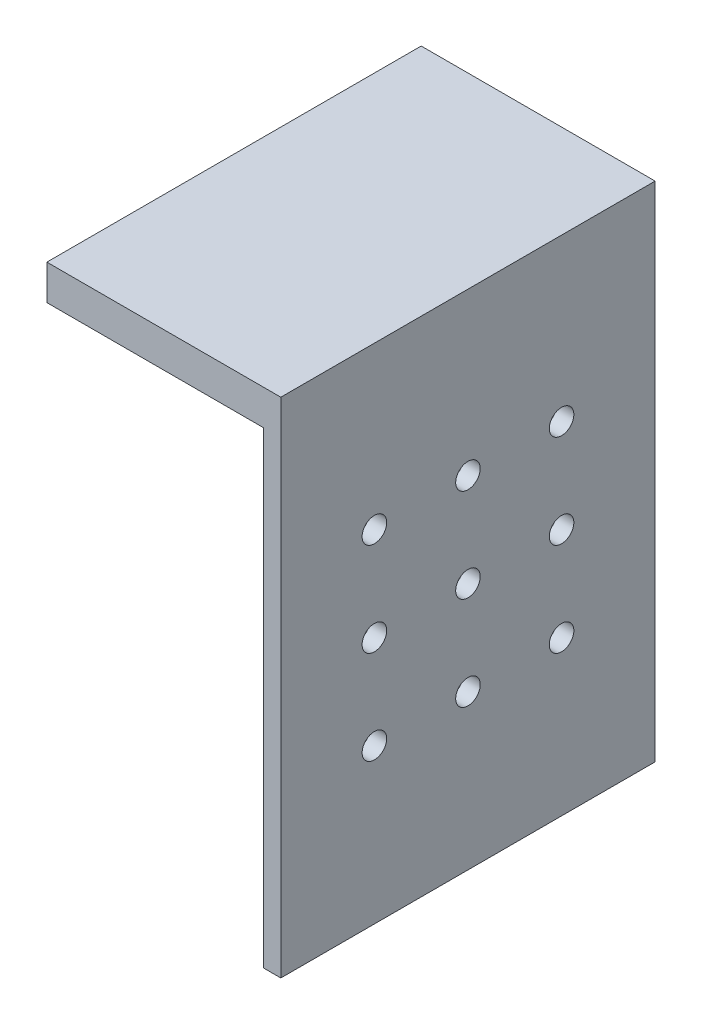
ISO-10303-21;
HEADER;
FILE_DESCRIPTION(('STEP AP214'),'2;1');
FILE_NAME('part.step','',(''),(''),'','','');
FILE_SCHEMA(('AUTOMOTIVE_DESIGN { 1 0 10303 214 1 1 1 1 }'));
ENDSEC;
DATA;
#1=APPLICATION_CONTEXT('core data for automotive mechanical design processes');
#2=APPLICATION_PROTOCOL_DEFINITION('international standard','automotive_design',2000,#1);
#3=PRODUCT_CONTEXT('',#1,'mechanical');
#4=PRODUCT('Part','Part','',(#3));
#5=PRODUCT_RELATED_PRODUCT_CATEGORY('part','',(#4));
#6=PRODUCT_DEFINITION_FORMATION('','',#4);
#7=PRODUCT_DEFINITION_CONTEXT('part definition',#1,'design');
#8=PRODUCT_DEFINITION('design','',#6,#7);
#9=PRODUCT_DEFINITION_SHAPE('','',#8);
#10=(LENGTH_UNIT() NAMED_UNIT(*) SI_UNIT(.MILLI.,.METRE.));
#11=(NAMED_UNIT(*) PLANE_ANGLE_UNIT() SI_UNIT($,.RADIAN.));
#12=(NAMED_UNIT(*) SI_UNIT($,.STERADIAN.) SOLID_ANGLE_UNIT());
#13=UNCERTAINTY_MEASURE_WITH_UNIT(LENGTH_MEASURE(1.E-05),#10,'distance_accuracy_value','');
#14=(GEOMETRIC_REPRESENTATION_CONTEXT(3) GLOBAL_UNCERTAINTY_ASSIGNED_CONTEXT((#13)) GLOBAL_UNIT_ASSIGNED_CONTEXT((#10,
#11,#12)) REPRESENTATION_CONTEXT('',''));
#15=CARTESIAN_POINT('',(0.,0.,0.));
#16=DIRECTION('',(0.,0.,1.));
#17=DIRECTION('',(1.,0.,0.));
#18=AXIS2_PLACEMENT_3D('',#15,#16,#17);
#19=CARTESIAN_POINT('',(0.,0.,32.));
#20=DIRECTION('',(1.,0.,0.));
#21=DIRECTION('',(0.,0.,-1.));
#22=AXIS2_PLACEMENT_3D('',#19,#20,#21);
#23=PLANE('',#22);
#24=DIRECTION('',(0.,-1.,0.));
#25=VECTOR('',#24,1.);
#26=CARTESIAN_POINT('',(0.,0.,32.));
#27=LINE('',#26,#25);
#28=CARTESIAN_POINT('',(0.,48.,32.));
#29=VERTEX_POINT('',#28);
#30=CARTESIAN_POINT('',(0.,45.,32.));
#31=VERTEX_POINT('',#30);
#32=EDGE_CURVE('E49',#29,#31,#27,.T.);
#33=ORIENTED_EDGE('',*,*,#32,.F.);
#34=DIRECTION('',(0.,0.,1.));
#35=VECTOR('',#34,1.);
#36=CARTESIAN_POINT('',(0.,48.,0.));
#37=LINE('',#36,#35);
#38=CARTESIAN_POINT('',(0.,48.,0.));
#39=VERTEX_POINT('',#38);
#40=EDGE_CURVE('E96',#39,#29,#37,.T.);
#41=ORIENTED_EDGE('',*,*,#40,.F.);
#42=DIRECTION('',(0.,-1.,0.));
#43=VECTOR('',#42,1.);
#44=CARTESIAN_POINT('',(0.,0.,0.));
#45=LINE('',#44,#43);
#46=CARTESIAN_POINT('',(0.,45.,0.));
#47=VERTEX_POINT('',#46);
#48=EDGE_CURVE('E107',#39,#47,#45,.T.);
#49=ORIENTED_EDGE('',*,*,#48,.T.);
#50=DIRECTION('',(0.,0.,1.));
#51=VECTOR('',#50,1.);
#52=CARTESIAN_POINT('',(0.,45.,0.));
#53=LINE('',#52,#51);
#54=EDGE_CURVE('E115',#47,#31,#53,.T.);
#55=ORIENTED_EDGE('',*,*,#54,.T.);
#56=EDGE_LOOP('',(#33,#41,#49,#55));
#57=FACE_BOUND('',#56,.T.);
#58=ADVANCED_FACE('F41',(#57),#23,.F.);
#59=CARTESIAN_POINT('',(0.,0.,32.));
#60=DIRECTION('',(0.,0.,-1.));
#61=DIRECTION('',(-1.,0.,0.));
#62=AXIS2_PLACEMENT_3D('',#59,#60,#61);
#63=PLANE('',#62);
#64=DIRECTION('',(0.,-1.,0.));
#65=VECTOR('',#64,1.);
#66=CARTESIAN_POINT('',(20.,50.,32.));
#67=LINE('',#66,#65);
#68=CARTESIAN_POINT('',(20.,48.,32.));
#69=VERTEX_POINT('',#68);
#70=CARTESIAN_POINT('',(20.,5.,32.));
#71=VERTEX_POINT('',#70);
#72=EDGE_CURVE('E130',#69,#71,#67,.T.);
#73=ORIENTED_EDGE('',*,*,#72,.F.);
#74=DIRECTION('',(1.,0.,0.));
#75=VECTOR('',#74,1.);
#76=CARTESIAN_POINT('',(0.,48.,32.));
#77=LINE('',#76,#75);
#78=EDGE_CURVE('E56',#29,#69,#77,.T.);
#79=ORIENTED_EDGE('',*,*,#78,.F.);
#80=ORIENTED_EDGE('',*,*,#32,.T.);
#81=DIRECTION('',(-1.,0.,0.));
#82=VECTOR('',#81,1.);
#83=CARTESIAN_POINT('',(13.,45.,32.));
#84=LINE('',#83,#82);
#85=CARTESIAN_POINT('',(18.5380609826533,45.,32.));
#86=VERTEX_POINT('',#85);
#87=EDGE_CURVE('E121',#86,#31,#84,.T.);
#88=ORIENTED_EDGE('',*,*,#87,.F.);
#89=DIRECTION('',(0.,1.,0.));
#90=VECTOR('',#89,1.);
#91=CARTESIAN_POINT('',(18.5380609826533,45.,32.));
#92=LINE('',#91,#90);
#93=CARTESIAN_POINT('',(18.5380609826533,5.,32.));
#94=VERTEX_POINT('',#93);
#95=EDGE_CURVE('E228',#94,#86,#92,.T.);
#96=ORIENTED_EDGE('',*,*,#95,.F.);
#97=DIRECTION('',(-1.,0.,0.));
#98=VECTOR('',#97,1.);
#99=CARTESIAN_POINT('',(16.,5.,32.));
#100=LINE('',#99,#98);
#101=EDGE_CURVE('E178',#71,#94,#100,.T.);
#102=ORIENTED_EDGE('',*,*,#101,.F.);
#103=EDGE_LOOP('',(#73,#79,#80,#88,#96,#102));
#104=FACE_BOUND('',#103,.T.);
#105=ADVANCED_FACE('F244',(#104),#63,.F.);
#106=CARTESIAN_POINT('',(0.,0.,0.));
#107=DIRECTION('',(0.,0.,-1.));
#108=DIRECTION('',(-1.,0.,0.));
#109=AXIS2_PLACEMENT_3D('',#106,#107,#108);
#110=PLANE('',#109);
#111=DIRECTION('',(1.,0.,0.));
#112=VECTOR('',#111,1.);
#113=CARTESIAN_POINT('',(0.,48.,0.));
#114=LINE('',#113,#112);
#115=CARTESIAN_POINT('',(20.,48.,0.));
#116=VERTEX_POINT('',#115);
#117=EDGE_CURVE('E93',#39,#116,#114,.T.);
#118=ORIENTED_EDGE('',*,*,#117,.T.);
#119=DIRECTION('',(0.,1.,0.));
#120=VECTOR('',#119,1.);
#121=CARTESIAN_POINT('',(20.,50.,0.));
#122=LINE('',#121,#120);
#123=CARTESIAN_POINT('',(20.,5.,0.));
#124=VERTEX_POINT('',#123);
#125=EDGE_CURVE('E125',#124,#116,#122,.T.);
#126=ORIENTED_EDGE('',*,*,#125,.F.);
#127=DIRECTION('',(-1.,0.,0.));
#128=VECTOR('',#127,1.);
#129=CARTESIAN_POINT('',(16.,5.,0.));
#130=LINE('',#129,#128);
#131=CARTESIAN_POINT('',(18.5380609826533,5.,0.));
#132=VERTEX_POINT('',#131);
#133=EDGE_CURVE('E177',#124,#132,#130,.T.);
#134=ORIENTED_EDGE('',*,*,#133,.T.);
#135=DIRECTION('',(0.,1.,0.));
#136=VECTOR('',#135,1.);
#137=CARTESIAN_POINT('',(18.5380609826533,45.,0.));
#138=LINE('',#137,#136);
#139=CARTESIAN_POINT('',(18.5380609826533,45.,0.));
#140=VERTEX_POINT('',#139);
#141=EDGE_CURVE('E64',#132,#140,#138,.T.);
#142=ORIENTED_EDGE('',*,*,#141,.T.);
#143=DIRECTION('',(-1.,0.,0.));
#144=VECTOR('',#143,1.);
#145=CARTESIAN_POINT('',(13.,45.,0.));
#146=LINE('',#145,#144);
#147=EDGE_CURVE('E113',#140,#47,#146,.T.);
#148=ORIENTED_EDGE('',*,*,#147,.T.);
#149=ORIENTED_EDGE('',*,*,#48,.F.);
#150=EDGE_LOOP('',(#118,#126,#134,#142,#148,#149));
#151=FACE_BOUND('',#150,.T.);
#152=ADVANCED_FACE('F112',(#151),#110,.T.);
#153=CARTESIAN_POINT('',(13.,45.,0.));
#154=DIRECTION('',(0.,1.,0.));
#155=DIRECTION('',(0.,0.,1.));
#156=AXIS2_PLACEMENT_3D('',#153,#154,#155);
#157=PLANE('',#156);
#158=CARTESIAN_POINT('',(3.,45.,16.));
#159=DIRECTION('',(0.,1.,0.));
#160=DIRECTION('',(0.,0.,1.));
#161=AXIS2_PLACEMENT_3D('',#158,#159,#160);
#162=CIRCLE('',#161,1.5);
#163=CARTESIAN_POINT('',(3.,45.,17.5));
#164=VERTEX_POINT('',#163);
#165=EDGE_CURVE('E11',#164,#164,#162,.F.);
#166=ORIENTED_EDGE('',*,*,#165,.F.);
#167=EDGE_LOOP('',(#166));
#168=FACE_BOUND('',#167,.T.);
#169=ORIENTED_EDGE('',*,*,#87,.T.);
#170=ORIENTED_EDGE('',*,*,#54,.F.);
#171=ORIENTED_EDGE('',*,*,#147,.F.);
#172=DIRECTION('',(0.,0.,1.));
#173=VECTOR('',#172,1.);
#174=CARTESIAN_POINT('',(18.5380609826533,45.,0.));
#175=LINE('',#174,#173);
#176=EDGE_CURVE('E221',#140,#86,#175,.T.);
#177=ORIENTED_EDGE('',*,*,#176,.T.);
#178=EDGE_LOOP('',(#169,#170,#171,#177));
#179=FACE_BOUND('',#178,.T.);
#180=ADVANCED_FACE('F251',(#168,#179),#157,.F.);
#181=CARTESIAN_POINT('',(20.,0.,0.));
#182=DIRECTION('',(1.,0.,0.));
#183=DIRECTION('',(0.,0.,-1.));
#184=AXIS2_PLACEMENT_3D('',#181,#182,#183);
#185=PLANE('',#184);
#186=DIRECTION('',(0.,0.,1.));
#187=VECTOR('',#186,1.);
#188=CARTESIAN_POINT('',(20.,48.,0.));
#189=LINE('',#188,#187);
#190=EDGE_CURVE('E97',#116,#69,#189,.T.);
#191=ORIENTED_EDGE('',*,*,#190,.T.);
#192=ORIENTED_EDGE('',*,*,#72,.T.);
#193=DIRECTION('',(0.,0.,1.));
#194=VECTOR('',#193,1.);
#195=CARTESIAN_POINT('',(20.,5.,0.));
#196=LINE('',#195,#194);
#197=EDGE_CURVE('E163',#124,#71,#196,.T.);
#198=ORIENTED_EDGE('',*,*,#197,.F.);
#199=ORIENTED_EDGE('',*,*,#125,.T.);
#200=EDGE_LOOP('',(#191,#192,#198,#199));
#201=FACE_BOUND('',#200,.T.);
#202=CARTESIAN_POINT('',(20.,26.2,24.));
#203=DIRECTION('',(1.,0.,0.));
#204=DIRECTION('',(0.,0.,-1.));
#205=AXIS2_PLACEMENT_3D('',#202,#203,#204);
#206=CIRCLE('',#205,1.05);
#207=CARTESIAN_POINT('',(20.,26.2,22.95));
#208=VERTEX_POINT('',#207);
#209=EDGE_CURVE('E141',#208,#208,#206,.T.);
#210=ORIENTED_EDGE('',*,*,#209,.F.);
#211=EDGE_LOOP('',(#210));
#212=FACE_BOUND('',#211,.T.);
#213=CARTESIAN_POINT('',(20.,18.2,24.));
#214=DIRECTION('',(1.,0.,0.));
#215=DIRECTION('',(0.,0.,-1.));
#216=AXIS2_PLACEMENT_3D('',#213,#214,#215);
#217=CIRCLE('',#216,1.05);
#218=CARTESIAN_POINT('',(20.,18.2,22.95));
#219=VERTEX_POINT('',#218);
#220=EDGE_CURVE('E151',#219,#219,#217,.T.);
#221=ORIENTED_EDGE('',*,*,#220,.F.);
#222=EDGE_LOOP('',(#221));
#223=FACE_BOUND('',#222,.T.);
#224=CARTESIAN_POINT('',(20.,34.2,16.));
#225=DIRECTION('',(1.,0.,0.));
#226=DIRECTION('',(0.,0.,-1.));
#227=AXIS2_PLACEMENT_3D('',#224,#225,#226);
#228=CIRCLE('',#227,1.05);
#229=CARTESIAN_POINT('',(20.,34.2,14.95));
#230=VERTEX_POINT('',#229);
#231=EDGE_CURVE('E146',#230,#230,#228,.T.);
#232=ORIENTED_EDGE('',*,*,#231,.F.);
#233=EDGE_LOOP('',(#232));
#234=FACE_BOUND('',#233,.T.);
#235=CARTESIAN_POINT('',(20.,26.2,16.));
#236=DIRECTION('',(1.,0.,0.));
#237=DIRECTION('',(0.,0.,-1.));
#238=AXIS2_PLACEMENT_3D('',#235,#236,#237);
#239=CIRCLE('',#238,1.05);
#240=CARTESIAN_POINT('',(20.,26.2,14.95));
#241=VERTEX_POINT('',#240);
#242=EDGE_CURVE('E142',#241,#241,#239,.T.);
#243=ORIENTED_EDGE('',*,*,#242,.F.);
#244=EDGE_LOOP('',(#243));
#245=FACE_BOUND('',#244,.T.);
#246=CARTESIAN_POINT('',(20.,18.2,16.));
#247=DIRECTION('',(1.,0.,0.));
#248=DIRECTION('',(0.,0.,-1.));
#249=AXIS2_PLACEMENT_3D('',#246,#247,#248);
#250=CIRCLE('',#249,1.05);
#251=CARTESIAN_POINT('',(20.,18.2,14.95));
#252=VERTEX_POINT('',#251);
#253=EDGE_CURVE('E147',#252,#252,#250,.T.);
#254=ORIENTED_EDGE('',*,*,#253,.F.);
#255=EDGE_LOOP('',(#254));
#256=FACE_BOUND('',#255,.T.);
#257=CARTESIAN_POINT('',(20.,18.2,8.));
#258=DIRECTION('',(1.,0.,0.));
#259=DIRECTION('',(0.,0.,-1.));
#260=AXIS2_PLACEMENT_3D('',#257,#258,#259);
#261=CIRCLE('',#260,1.05);
#262=CARTESIAN_POINT('',(20.,18.2,6.95));
#263=VERTEX_POINT('',#262);
#264=EDGE_CURVE('E167',#263,#263,#261,.T.);
#265=ORIENTED_EDGE('',*,*,#264,.F.);
#266=EDGE_LOOP('',(#265));
#267=FACE_BOUND('',#266,.T.);
#268=CARTESIAN_POINT('',(20.,26.2,8.));
#269=DIRECTION('',(1.,0.,0.));
#270=DIRECTION('',(0.,0.,-1.));
#271=AXIS2_PLACEMENT_3D('',#268,#269,#270);
#272=CIRCLE('',#271,1.05);
#273=CARTESIAN_POINT('',(20.,26.2,6.95));
#274=VERTEX_POINT('',#273);
#275=EDGE_CURVE('E162',#274,#274,#272,.T.);
#276=ORIENTED_EDGE('',*,*,#275,.F.);
#277=EDGE_LOOP('',(#276));
#278=FACE_BOUND('',#277,.T.);
#279=CARTESIAN_POINT('',(20.,34.2,8.));
#280=DIRECTION('',(1.,0.,0.));
#281=DIRECTION('',(0.,0.,-1.));
#282=AXIS2_PLACEMENT_3D('',#279,#280,#281);
#283=CIRCLE('',#282,1.05);
#284=CARTESIAN_POINT('',(20.,34.2,6.95));
#285=VERTEX_POINT('',#284);
#286=EDGE_CURVE('E158',#285,#285,#283,.T.);
#287=ORIENTED_EDGE('',*,*,#286,.F.);
#288=EDGE_LOOP('',(#287));
#289=FACE_BOUND('',#288,.T.);
#290=CARTESIAN_POINT('',(20.,34.2,24.));
#291=DIRECTION('',(1.,0.,0.));
#292=DIRECTION('',(0.,0.,-1.));
#293=AXIS2_PLACEMENT_3D('',#290,#291,#292);
#294=CIRCLE('',#293,1.05);
#295=CARTESIAN_POINT('',(20.,34.2,22.95));
#296=VERTEX_POINT('',#295);
#297=EDGE_CURVE('E137',#296,#296,#294,.T.);
#298=ORIENTED_EDGE('',*,*,#297,.F.);
#299=EDGE_LOOP('',(#298));
#300=FACE_BOUND('',#299,.T.);
#301=ADVANCED_FACE('F239',(#201,#212,#223,#234,#245,#256,#267,#278,#289,#300),#185,.T.);
#302=CARTESIAN_POINT('',(3.,40.,16.));
#303=DIRECTION('',(0.,1.,0.));
#304=DIRECTION('',(0.,0.,1.));
#305=AXIS2_PLACEMENT_3D('',#302,#303,#304);
#306=CYLINDRICAL_SURFACE('',#305,1.5);
#307=CARTESIAN_POINT('',(3.,40.,16.));
#308=DIRECTION('',(0.,-1.,0.));
#309=DIRECTION('',(0.,0.,-1.));
#310=AXIS2_PLACEMENT_3D('',#307,#308,#309);
#311=CIRCLE('',#310,1.5);
#312=CARTESIAN_POINT('',(3.,40.,14.5));
#313=VERTEX_POINT('',#312);
#314=EDGE_CURVE('E133',#313,#313,#311,.T.);
#315=ORIENTED_EDGE('',*,*,#314,.F.);
#316=EDGE_LOOP('',(#315));
#317=FACE_BOUND('',#316,.T.);
#318=ORIENTED_EDGE('',*,*,#165,.T.);
#319=EDGE_LOOP('',(#318));
#320=FACE_BOUND('',#319,.T.);
#321=ADVANCED_FACE('F259',(#317,#320),#306,.T.);
#322=CARTESIAN_POINT('',(3.,40.,16.));
#323=DIRECTION('',(0.,-1.,0.));
#324=DIRECTION('',(0.,0.,-1.));
#325=AXIS2_PLACEMENT_3D('',#322,#323,#324);
#326=PLANE('',#325);
#327=ORIENTED_EDGE('',*,*,#314,.T.);
#328=EDGE_LOOP('',(#327));
#329=FACE_BOUND('',#328,.T.);
#330=ADVANCED_FACE('F376',(#329),#326,.T.);
#331=CARTESIAN_POINT('',(0.,34.2,24.));
#332=DIRECTION('',(1.,0.,0.));
#333=DIRECTION('',(0.,0.,-1.));
#334=AXIS2_PLACEMENT_3D('',#331,#332,#333);
#335=CYLINDRICAL_SURFACE('',#334,1.05);
#336=CARTESIAN_POINT('',(18.5380609826533,34.2,24.));
#337=DIRECTION('',(1.,0.,0.));
#338=DIRECTION('',(0.,0.,-1.));
#339=AXIS2_PLACEMENT_3D('',#336,#337,#338);
#340=CIRCLE('',#339,1.05);
#341=CARTESIAN_POINT('',(18.5380609826533,34.2,22.95));
#342=VERTEX_POINT('',#341);
#343=EDGE_CURVE('E182',#342,#342,#340,.F.);
#344=ORIENTED_EDGE('',*,*,#343,.T.);
#345=EDGE_LOOP('',(#344));
#346=FACE_BOUND('',#345,.T.);
#347=ORIENTED_EDGE('',*,*,#297,.T.);
#348=EDGE_LOOP('',(#347));
#349=FACE_BOUND('',#348,.T.);
#350=ADVANCED_FACE('F368',(#346,#349),#335,.F.);
#351=CARTESIAN_POINT('',(0.,34.2,8.));
#352=DIRECTION('',(1.,0.,0.));
#353=DIRECTION('',(0.,0.,-1.));
#354=AXIS2_PLACEMENT_3D('',#351,#352,#353);
#355=CYLINDRICAL_SURFACE('',#354,1.05);
#356=CARTESIAN_POINT('',(18.5380609826533,34.2,8.));
#357=DIRECTION('',(1.,0.,0.));
#358=DIRECTION('',(0.,0.,-1.));
#359=AXIS2_PLACEMENT_3D('',#356,#357,#358);
#360=CIRCLE('',#359,1.05);
#361=CARTESIAN_POINT('',(18.5380609826533,34.2,6.95));
#362=VERTEX_POINT('',#361);
#363=EDGE_CURVE('E189',#362,#362,#360,.F.);
#364=ORIENTED_EDGE('',*,*,#363,.T.);
#365=EDGE_LOOP('',(#364));
#366=FACE_BOUND('',#365,.T.);
#367=ORIENTED_EDGE('',*,*,#286,.T.);
#368=EDGE_LOOP('',(#367));
#369=FACE_BOUND('',#368,.T.);
#370=ADVANCED_FACE('F360',(#366,#369),#355,.F.);
#371=CARTESIAN_POINT('',(0.,26.2,8.));
#372=DIRECTION('',(1.,0.,0.));
#373=DIRECTION('',(0.,0.,-1.));
#374=AXIS2_PLACEMENT_3D('',#371,#372,#373);
#375=CYLINDRICAL_SURFACE('',#374,1.05);
#376=CARTESIAN_POINT('',(18.5380609826533,26.2,8.));
#377=DIRECTION('',(1.,0.,0.));
#378=DIRECTION('',(0.,0.,-1.));
#379=AXIS2_PLACEMENT_3D('',#376,#377,#378);
#380=CIRCLE('',#379,1.05);
#381=CARTESIAN_POINT('',(18.5380609826533,26.2,6.95));
#382=VERTEX_POINT('',#381);
#383=EDGE_CURVE('E193',#382,#382,#380,.F.);
#384=ORIENTED_EDGE('',*,*,#383,.T.);
#385=EDGE_LOOP('',(#384));
#386=FACE_BOUND('',#385,.T.);
#387=ORIENTED_EDGE('',*,*,#275,.T.);
#388=EDGE_LOOP('',(#387));
#389=FACE_BOUND('',#388,.T.);
#390=ADVANCED_FACE('F352',(#386,#389),#375,.F.);
#391=CARTESIAN_POINT('',(0.,18.2,8.));
#392=DIRECTION('',(1.,0.,0.));
#393=DIRECTION('',(0.,0.,-1.));
#394=AXIS2_PLACEMENT_3D('',#391,#392,#393);
#395=CYLINDRICAL_SURFACE('',#394,1.05);
#396=CARTESIAN_POINT('',(18.5380609826533,18.2,8.));
#397=DIRECTION('',(1.,0.,0.));
#398=DIRECTION('',(0.,0.,-1.));
#399=AXIS2_PLACEMENT_3D('',#396,#397,#398);
#400=CIRCLE('',#399,1.05);
#401=CARTESIAN_POINT('',(18.5380609826533,18.2,6.95));
#402=VERTEX_POINT('',#401);
#403=EDGE_CURVE('E197',#402,#402,#400,.F.);
#404=ORIENTED_EDGE('',*,*,#403,.T.);
#405=EDGE_LOOP('',(#404));
#406=FACE_BOUND('',#405,.T.);
#407=ORIENTED_EDGE('',*,*,#264,.T.);
#408=EDGE_LOOP('',(#407));
#409=FACE_BOUND('',#408,.T.);
#410=ADVANCED_FACE('F344',(#406,#409),#395,.F.);
#411=CARTESIAN_POINT('',(0.,18.2,16.));
#412=DIRECTION('',(1.,0.,0.));
#413=DIRECTION('',(0.,0.,-1.));
#414=AXIS2_PLACEMENT_3D('',#411,#412,#413);
#415=CYLINDRICAL_SURFACE('',#414,1.05);
#416=CARTESIAN_POINT('',(18.5380609826533,18.2,16.));
#417=DIRECTION('',(1.,0.,0.));
#418=DIRECTION('',(0.,0.,-1.));
#419=AXIS2_PLACEMENT_3D('',#416,#417,#418);
#420=CIRCLE('',#419,1.05);
#421=CARTESIAN_POINT('',(18.5380609826533,18.2,14.95));
#422=VERTEX_POINT('',#421);
#423=EDGE_CURVE('E201',#422,#422,#420,.F.);
#424=ORIENTED_EDGE('',*,*,#423,.T.);
#425=EDGE_LOOP('',(#424));
#426=FACE_BOUND('',#425,.T.);
#427=ORIENTED_EDGE('',*,*,#253,.T.);
#428=EDGE_LOOP('',(#427));
#429=FACE_BOUND('',#428,.T.);
#430=ADVANCED_FACE('F336',(#426,#429),#415,.F.);
#431=CARTESIAN_POINT('',(0.,26.2,16.));
#432=DIRECTION('',(1.,0.,0.));
#433=DIRECTION('',(0.,0.,-1.));
#434=AXIS2_PLACEMENT_3D('',#431,#432,#433);
#435=CYLINDRICAL_SURFACE('',#434,1.05);
#436=CARTESIAN_POINT('',(18.5380609826533,26.2,16.));
#437=DIRECTION('',(1.,0.,0.));
#438=DIRECTION('',(0.,0.,-1.));
#439=AXIS2_PLACEMENT_3D('',#436,#437,#438);
#440=CIRCLE('',#439,1.05);
#441=CARTESIAN_POINT('',(18.5380609826533,26.2,14.95));
#442=VERTEX_POINT('',#441);
#443=EDGE_CURVE('E205',#442,#442,#440,.F.);
#444=ORIENTED_EDGE('',*,*,#443,.T.);
#445=EDGE_LOOP('',(#444));
#446=FACE_BOUND('',#445,.T.);
#447=ORIENTED_EDGE('',*,*,#242,.T.);
#448=EDGE_LOOP('',(#447));
#449=FACE_BOUND('',#448,.T.);
#450=ADVANCED_FACE('F328',(#446,#449),#435,.F.);
#451=CARTESIAN_POINT('',(0.,34.2,16.));
#452=DIRECTION('',(1.,0.,0.));
#453=DIRECTION('',(0.,0.,-1.));
#454=AXIS2_PLACEMENT_3D('',#451,#452,#453);
#455=CYLINDRICAL_SURFACE('',#454,1.05);
#456=CARTESIAN_POINT('',(18.5380609826533,34.2,16.));
#457=DIRECTION('',(1.,0.,0.));
#458=DIRECTION('',(0.,0.,-1.));
#459=AXIS2_PLACEMENT_3D('',#456,#457,#458);
#460=CIRCLE('',#459,1.05);
#461=CARTESIAN_POINT('',(18.5380609826533,34.2,14.95));
#462=VERTEX_POINT('',#461);
#463=EDGE_CURVE('E209',#462,#462,#460,.F.);
#464=ORIENTED_EDGE('',*,*,#463,.T.);
#465=EDGE_LOOP('',(#464));
#466=FACE_BOUND('',#465,.T.);
#467=ORIENTED_EDGE('',*,*,#231,.T.);
#468=EDGE_LOOP('',(#467));
#469=FACE_BOUND('',#468,.T.);
#470=ADVANCED_FACE('F320',(#466,#469),#455,.F.);
#471=CARTESIAN_POINT('',(0.,18.2,24.));
#472=DIRECTION('',(1.,0.,0.));
#473=DIRECTION('',(0.,0.,-1.));
#474=AXIS2_PLACEMENT_3D('',#471,#472,#473);
#475=CYLINDRICAL_SURFACE('',#474,1.05);
#476=CARTESIAN_POINT('',(18.5380609826533,18.2,24.));
#477=DIRECTION('',(1.,0.,0.));
#478=DIRECTION('',(0.,0.,-1.));
#479=AXIS2_PLACEMENT_3D('',#476,#477,#478);
#480=CIRCLE('',#479,1.05);
#481=CARTESIAN_POINT('',(18.5380609826533,18.2,22.95));
#482=VERTEX_POINT('',#481);
#483=EDGE_CURVE('E213',#482,#482,#480,.F.);
#484=ORIENTED_EDGE('',*,*,#483,.T.);
#485=EDGE_LOOP('',(#484));
#486=FACE_BOUND('',#485,.T.);
#487=ORIENTED_EDGE('',*,*,#220,.T.);
#488=EDGE_LOOP('',(#487));
#489=FACE_BOUND('',#488,.T.);
#490=ADVANCED_FACE('F312',(#486,#489),#475,.F.);
#491=CARTESIAN_POINT('',(0.,26.2,24.));
#492=DIRECTION('',(1.,0.,0.));
#493=DIRECTION('',(0.,0.,-1.));
#494=AXIS2_PLACEMENT_3D('',#491,#492,#493);
#495=CYLINDRICAL_SURFACE('',#494,1.05);
#496=CARTESIAN_POINT('',(18.5380609826533,26.2,24.));
#497=DIRECTION('',(1.,0.,0.));
#498=DIRECTION('',(0.,0.,-1.));
#499=AXIS2_PLACEMENT_3D('',#496,#497,#498);
#500=CIRCLE('',#499,1.05);
#501=CARTESIAN_POINT('',(18.5380609826533,26.2,22.95));
#502=VERTEX_POINT('',#501);
#503=EDGE_CURVE('E217',#502,#502,#500,.F.);
#504=ORIENTED_EDGE('',*,*,#503,.T.);
#505=EDGE_LOOP('',(#504));
#506=FACE_BOUND('',#505,.T.);
#507=ORIENTED_EDGE('',*,*,#209,.T.);
#508=EDGE_LOOP('',(#507));
#509=FACE_BOUND('',#508,.T.);
#510=ADVANCED_FACE('F305',(#506,#509),#495,.F.);
#511=CARTESIAN_POINT('',(16.,5.,0.));
#512=DIRECTION('',(0.,1.,0.));
#513=DIRECTION('',(-1.,0.,0.));
#514=AXIS2_PLACEMENT_3D('',#511,#512,#513);
#515=PLANE('',#514);
#516=ORIENTED_EDGE('',*,*,#101,.T.);
#517=DIRECTION('',(0.,0.,1.));
#518=VECTOR('',#517,1.);
#519=CARTESIAN_POINT('',(18.5380609826533,5.,0.));
#520=LINE('',#519,#518);
#521=EDGE_CURVE('E222',#132,#94,#520,.T.);
#522=ORIENTED_EDGE('',*,*,#521,.F.);
#523=ORIENTED_EDGE('',*,*,#133,.F.);
#524=ORIENTED_EDGE('',*,*,#197,.T.);
#525=EDGE_LOOP('',(#516,#522,#523,#524));
#526=FACE_BOUND('',#525,.T.);
#527=ADVANCED_FACE('F247',(#526),#515,.F.);
#528=CARTESIAN_POINT('',(18.5380609826533,45.,0.));
#529=DIRECTION('',(1.,0.,0.));
#530=DIRECTION('',(0.,0.,-1.));
#531=AXIS2_PLACEMENT_3D('',#528,#529,#530);
#532=PLANE('',#531);
#533=ORIENTED_EDGE('',*,*,#363,.F.);
#534=EDGE_LOOP('',(#533));
#535=FACE_BOUND('',#534,.T.);
#536=ORIENTED_EDGE('',*,*,#403,.F.);
#537=EDGE_LOOP('',(#536));
#538=FACE_BOUND('',#537,.T.);
#539=ORIENTED_EDGE('',*,*,#443,.F.);
#540=EDGE_LOOP('',(#539));
#541=FACE_BOUND('',#540,.T.);
#542=ORIENTED_EDGE('',*,*,#483,.F.);
#543=EDGE_LOOP('',(#542));
#544=FACE_BOUND('',#543,.T.);
#545=ORIENTED_EDGE('',*,*,#95,.T.);
#546=ORIENTED_EDGE('',*,*,#176,.F.);
#547=ORIENTED_EDGE('',*,*,#141,.F.);
#548=ORIENTED_EDGE('',*,*,#521,.T.);
#549=EDGE_LOOP('',(#545,#546,#547,#548));
#550=FACE_BOUND('',#549,.T.);
#551=ORIENTED_EDGE('',*,*,#503,.F.);
#552=EDGE_LOOP('',(#551));
#553=FACE_BOUND('',#552,.T.);
#554=ORIENTED_EDGE('',*,*,#463,.F.);
#555=EDGE_LOOP('',(#554));
#556=FACE_BOUND('',#555,.T.);
#557=ORIENTED_EDGE('',*,*,#423,.F.);
#558=EDGE_LOOP('',(#557));
#559=FACE_BOUND('',#558,.T.);
#560=ORIENTED_EDGE('',*,*,#383,.F.);
#561=EDGE_LOOP('',(#560));
#562=FACE_BOUND('',#561,.T.);
#563=ORIENTED_EDGE('',*,*,#343,.F.);
#564=EDGE_LOOP('',(#563));
#565=FACE_BOUND('',#564,.T.);
#566=ADVANCED_FACE('F248',(#535,#538,#541,#544,#550,#553,#556,#559,#562,#565),#532,.F.);
#567=CARTESIAN_POINT('',(0.,48.,0.));
#568=DIRECTION('',(0.,-1.,0.));
#569=DIRECTION('',(0.,0.,-1.));
#570=AXIS2_PLACEMENT_3D('',#567,#568,#569);
#571=PLANE('',#570);
#572=ORIENTED_EDGE('',*,*,#78,.T.);
#573=ORIENTED_EDGE('',*,*,#190,.F.);
#574=ORIENTED_EDGE('',*,*,#117,.F.);
#575=ORIENTED_EDGE('',*,*,#40,.T.);
#576=EDGE_LOOP('',(#572,#573,#574,#575));
#577=FACE_BOUND('',#576,.T.);
#578=ADVANCED_FACE('F95',(#577),#571,.F.);
#579=CLOSED_SHELL('',(#58,#105,#152,#180,#301,#321,#330,#350,#370,#390,#410,#430,#450,#470,#490,
#510,#527,#566,#578));
#580=MANIFOLD_SOLID_BREP('B2',#579);
#581=ADVANCED_BREP_SHAPE_REPRESENTATION('',(#18,#580),#14);
#582=SHAPE_DEFINITION_REPRESENTATION(#9,#581);
ENDSEC;
END-ISO-10303-21;
